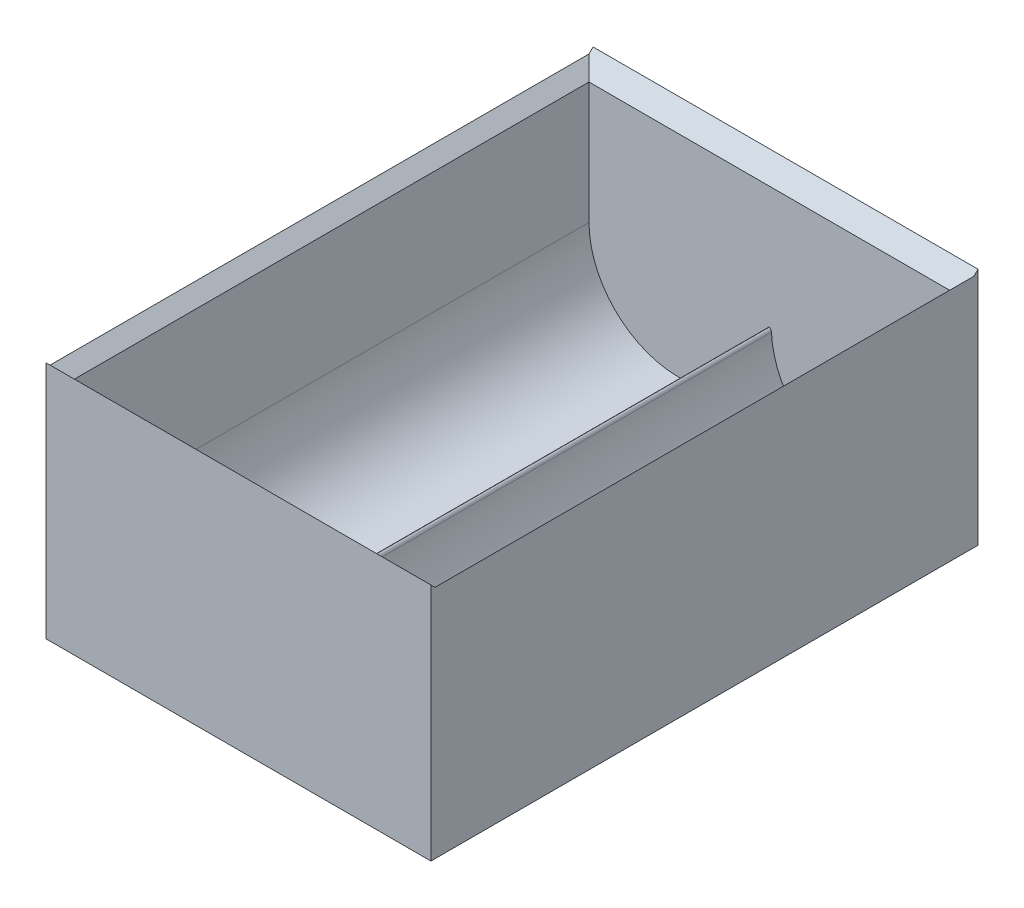
ISO-10303-21;
HEADER;
FILE_DESCRIPTION(('STEP AP214'),'2;1');
FILE_NAME('part.step','',(''),(''),'','','');
FILE_SCHEMA(('AUTOMOTIVE_DESIGN { 1 0 10303 214 1 1 1 1 }'));
ENDSEC;
DATA;
#1=APPLICATION_CONTEXT('core data for automotive mechanical design processes');
#2=APPLICATION_PROTOCOL_DEFINITION('international standard','automotive_design',2000,#1);
#3=PRODUCT_CONTEXT('',#1,'mechanical');
#4=PRODUCT('Part','Part','',(#3));
#5=PRODUCT_RELATED_PRODUCT_CATEGORY('part','',(#4));
#6=PRODUCT_DEFINITION_FORMATION('','',#4);
#7=PRODUCT_DEFINITION_CONTEXT('part definition',#1,'design');
#8=PRODUCT_DEFINITION('design','',#6,#7);
#9=PRODUCT_DEFINITION_SHAPE('','',#8);
#10=(LENGTH_UNIT() NAMED_UNIT(*) SI_UNIT(.MILLI.,.METRE.));
#11=(NAMED_UNIT(*) PLANE_ANGLE_UNIT() SI_UNIT($,.RADIAN.));
#12=(NAMED_UNIT(*) SI_UNIT($,.STERADIAN.) SOLID_ANGLE_UNIT());
#13=UNCERTAINTY_MEASURE_WITH_UNIT(LENGTH_MEASURE(1.E-05),#10,'distance_accuracy_value','');
#14=(GEOMETRIC_REPRESENTATION_CONTEXT(3) GLOBAL_UNCERTAINTY_ASSIGNED_CONTEXT((#13)) GLOBAL_UNIT_ASSIGNED_CONTEXT((#10,
#11,#12)) REPRESENTATION_CONTEXT('',''));
#15=CARTESIAN_POINT('',(0.,0.,0.));
#16=DIRECTION('',(0.,0.,1.));
#17=DIRECTION('',(1.,0.,0.));
#18=AXIS2_PLACEMENT_3D('',#15,#16,#17);
#19=CARTESIAN_POINT('',(47.5,65.,-67.5));
#20=DIRECTION('',(-1.,0.,0.));
#21=DIRECTION('',(0.,0.,1.));
#22=AXIS2_PLACEMENT_3D('',#19,#20,#21);
#23=PLANE('',#22);
#24=DIRECTION('',(0.,0.,1.));
#25=VECTOR('',#24,1.);
#26=CARTESIAN_POINT('',(47.5,57.9999999999999,-178.900179533069));
#27=LINE('',#26,#25);
#28=CARTESIAN_POINT('',(47.5,57.9999999999999,-66.5));
#29=VERTEX_POINT('',#28);
#30=CARTESIAN_POINT('',(47.5,57.9999999999999,66.5000000000001));
#31=VERTEX_POINT('',#30);
#32=EDGE_CURVE('E242',#29,#31,#27,.T.);
#33=ORIENTED_EDGE('',*,*,#32,.T.);
#34=DIRECTION('',(0.,0.707106781186544,0.707106781186551));
#35=VECTOR('',#34,1.);
#36=CARTESIAN_POINT('',(47.5,54.9999999999999,63.5));
#37=LINE('',#36,#35);
#38=CARTESIAN_POINT('',(47.5,58.9999999999999,67.5));
#39=VERTEX_POINT('',#38);
#40=EDGE_CURVE('E245',#31,#39,#37,.T.);
#41=ORIENTED_EDGE('',*,*,#40,.T.);
#42=DIRECTION('',(0.,-1.,0.));
#43=VECTOR('',#42,1.);
#44=CARTESIAN_POINT('',(47.5,65.,67.5));
#45=LINE('',#44,#43);
#46=CARTESIAN_POINT('',(47.5,0.,67.5));
#47=VERTEX_POINT('',#46);
#48=EDGE_CURVE('E205',#39,#47,#45,.T.);
#49=ORIENTED_EDGE('',*,*,#48,.T.);
#50=DIRECTION('',(0.,0.,-1.));
#51=VECTOR('',#50,1.);
#52=CARTESIAN_POINT('',(47.5,0.,-67.5));
#53=LINE('',#52,#51);
#54=CARTESIAN_POINT('',(47.5,0.,-67.5));
#55=VERTEX_POINT('',#54);
#56=EDGE_CURVE('E188',#47,#55,#53,.T.);
#57=ORIENTED_EDGE('',*,*,#56,.T.);
#58=DIRECTION('',(0.,-1.,0.));
#59=VECTOR('',#58,1.);
#60=CARTESIAN_POINT('',(47.5,65.,-67.5));
#61=LINE('',#60,#59);
#62=CARTESIAN_POINT('',(47.5,58.9999999999999,-67.5));
#63=VERTEX_POINT('',#62);
#64=EDGE_CURVE('E214',#63,#55,#61,.T.);
#65=ORIENTED_EDGE('',*,*,#64,.F.);
#66=DIRECTION('',(0.,0.707106781186544,-0.707106781186551));
#67=VECTOR('',#66,1.);
#68=CARTESIAN_POINT('',(47.5,65.,-73.5000000000002));
#69=LINE('',#68,#67);
#70=EDGE_CURVE('E239',#63,#29,#69,.F.);
#71=ORIENTED_EDGE('',*,*,#70,.T.);
#72=EDGE_LOOP('',(#33,#41,#49,#57,#65,#71));
#73=FACE_BOUND('',#72,.T.);
#74=ADVANCED_FACE('F49',(#73),#23,.F.);
#75=CARTESIAN_POINT('',(-47.5,65.,-67.5));
#76=DIRECTION('',(0.,0.,1.));
#77=DIRECTION('',(1.,0.,0.));
#78=AXIS2_PLACEMENT_3D('',#75,#76,#77);
#79=PLANE('',#78);
#80=DIRECTION('',(0.,-1.,0.));
#81=VECTOR('',#80,1.);
#82=CARTESIAN_POINT('',(-47.5,65.,-67.5));
#83=LINE('',#82,#81);
#84=CARTESIAN_POINT('',(-47.5,58.9999999999999,-67.5));
#85=VERTEX_POINT('',#84);
#86=CARTESIAN_POINT('',(-47.5,0.,-67.5));
#87=VERTEX_POINT('',#86);
#88=EDGE_CURVE('E211',#85,#87,#83,.T.);
#89=ORIENTED_EDGE('',*,*,#88,.F.);
#90=DIRECTION('',(-1.,0.,0.));
#91=VECTOR('',#90,1.);
#92=CARTESIAN_POINT('',(0.,58.9999999999999,-67.5));
#93=LINE('',#92,#91);
#94=EDGE_CURVE('E60',#85,#63,#93,.F.);
#95=ORIENTED_EDGE('',*,*,#94,.T.);
#96=ORIENTED_EDGE('',*,*,#64,.T.);
#97=DIRECTION('',(-1.,0.,0.));
#98=VECTOR('',#97,1.);
#99=CARTESIAN_POINT('',(-47.5,0.,-67.5));
#100=LINE('',#99,#98);
#101=EDGE_CURVE('E193',#55,#87,#100,.T.);
#102=ORIENTED_EDGE('',*,*,#101,.T.);
#103=EDGE_LOOP('',(#89,#95,#96,#102));
#104=FACE_BOUND('',#103,.T.);
#105=ADVANCED_FACE('F297',(#104),#79,.F.);
#106=CARTESIAN_POINT('',(-47.5,65.,-67.5));
#107=DIRECTION('',(1.,0.,0.));
#108=DIRECTION('',(0.,0.,-1.));
#109=AXIS2_PLACEMENT_3D('',#106,#107,#108);
#110=PLANE('',#109);
#111=DIRECTION('',(0.,-1.,0.));
#112=VECTOR('',#111,1.);
#113=CARTESIAN_POINT('',(-47.5,65.,67.5));
#114=LINE('',#113,#112);
#115=CARTESIAN_POINT('',(-47.5,58.9999999999999,67.5));
#116=VERTEX_POINT('',#115);
#117=CARTESIAN_POINT('',(-47.5,0.,67.5));
#118=VERTEX_POINT('',#117);
#119=EDGE_CURVE('E208',#116,#118,#114,.T.);
#120=ORIENTED_EDGE('',*,*,#119,.F.);
#121=DIRECTION('',(0.,-0.707106781186544,-0.707106781186551));
#122=VECTOR('',#121,1.);
#123=CARTESIAN_POINT('',(-47.5,54.9999999999999,63.5));
#124=LINE('',#123,#122);
#125=CARTESIAN_POINT('',(-47.5,57.9999999999999,66.5));
#126=VERTEX_POINT('',#125);
#127=EDGE_CURVE('E258',#116,#126,#124,.T.);
#128=ORIENTED_EDGE('',*,*,#127,.T.);
#129=DIRECTION('',(0.,0.,1.));
#130=VECTOR('',#129,1.);
#131=CARTESIAN_POINT('',(-47.5,57.9999999999999,0.));
#132=LINE('',#131,#130);
#133=CARTESIAN_POINT('',(-47.5,57.9999999999999,-66.5));
#134=VERTEX_POINT('',#133);
#135=EDGE_CURVE('E255',#126,#134,#132,.F.);
#136=ORIENTED_EDGE('',*,*,#135,.T.);
#137=DIRECTION('',(0.,-0.707106781186544,0.707106781186551));
#138=VECTOR('',#137,1.);
#139=CARTESIAN_POINT('',(-47.5,65.,-73.5000000000002));
#140=LINE('',#139,#138);
#141=EDGE_CURVE('E252',#134,#85,#140,.F.);
#142=ORIENTED_EDGE('',*,*,#141,.T.);
#143=ORIENTED_EDGE('',*,*,#88,.T.);
#144=DIRECTION('',(0.,0.,1.));
#145=VECTOR('',#144,1.);
#146=CARTESIAN_POINT('',(-47.5,0.,-67.5));
#147=LINE('',#146,#145);
#148=EDGE_CURVE('E197',#87,#118,#147,.T.);
#149=ORIENTED_EDGE('',*,*,#148,.T.);
#150=EDGE_LOOP('',(#120,#128,#136,#142,#143,#149));
#151=FACE_BOUND('',#150,.T.);
#152=ADVANCED_FACE('F295',(#151),#110,.F.);
#153=CARTESIAN_POINT('',(-47.5,65.,67.5));
#154=DIRECTION('',(0.,0.,-1.));
#155=DIRECTION('',(-1.,0.,0.));
#156=AXIS2_PLACEMENT_3D('',#153,#154,#155);
#157=PLANE('',#156);
#158=ORIENTED_EDGE('',*,*,#48,.F.);
#159=DIRECTION('',(-1.,0.,0.));
#160=VECTOR('',#159,1.);
#161=CARTESIAN_POINT('',(0.,58.9999999999999,67.5));
#162=LINE('',#161,#160);
#163=EDGE_CURVE('E249',#39,#116,#162,.T.);
#164=ORIENTED_EDGE('',*,*,#163,.T.);
#165=ORIENTED_EDGE('',*,*,#119,.T.);
#166=DIRECTION('',(1.,0.,0.));
#167=VECTOR('',#166,1.);
#168=CARTESIAN_POINT('',(-47.5,0.,67.5));
#169=LINE('',#168,#167);
#170=EDGE_CURVE('E201',#118,#47,#169,.T.);
#171=ORIENTED_EDGE('',*,*,#170,.T.);
#172=EDGE_LOOP('',(#158,#164,#165,#171));
#173=FACE_BOUND('',#172,.T.);
#174=ADVANCED_FACE('F386',(#173),#157,.F.);
#175=CARTESIAN_POINT('',(0.,0.,0.));
#176=DIRECTION('',(0.,1.,0.));
#177=DIRECTION('',(0.,0.,1.));
#178=AXIS2_PLACEMENT_3D('',#175,#176,#177);
#179=PLANE('',#178);
#180=ORIENTED_EDGE('',*,*,#56,.F.);
#181=ORIENTED_EDGE('',*,*,#170,.F.);
#182=ORIENTED_EDGE('',*,*,#148,.F.);
#183=ORIENTED_EDGE('',*,*,#101,.F.);
#184=EDGE_LOOP('',(#180,#181,#182,#183));
#185=FACE_BOUND('',#184,.T.);
#186=ADVANCED_FACE('F304',(#185),#179,.F.);
#187=CARTESIAN_POINT('',(22.5,25.,-178.900179533069));
#188=DIRECTION('',(0.,0.,1.));
#189=DIRECTION('',(1.,0.,0.));
#190=AXIS2_PLACEMENT_3D('',#187,#188,#189);
#191=CYLINDRICAL_SURFACE('',#190,22.);
#192=CARTESIAN_POINT('',(22.5,25.,-63.5));
#193=DIRECTION('',(0.,0.,1.));
#194=DIRECTION('',(1.,0.,0.));
#195=AXIS2_PLACEMENT_3D('',#192,#193,#194);
#196=CIRCLE('',#195,22.);
#197=CARTESIAN_POINT('',(0.520803787158835,24.0434782608696,-63.5));
#198=VERTEX_POINT('',#197);
#199=CARTESIAN_POINT('',(44.5,25.,-63.5));
#200=VERTEX_POINT('',#199);
#201=EDGE_CURVE('E189',#198,#200,#196,.T.);
#202=ORIENTED_EDGE('',*,*,#201,.F.);
#203=DIRECTION('',(0.,0.,1.));
#204=VECTOR('',#203,1.);
#205=CARTESIAN_POINT('',(0.520803787158835,24.0434782608696,-178.900179533069));
#206=LINE('',#205,#204);
#207=CARTESIAN_POINT('',(0.520803787158835,24.0434782608696,63.5));
#208=VERTEX_POINT('',#207);
#209=EDGE_CURVE('E163',#198,#208,#206,.T.);
#210=ORIENTED_EDGE('',*,*,#209,.T.);
#211=CARTESIAN_POINT('',(22.5,25.,63.5));
#212=DIRECTION('',(0.,0.,1.));
#213=DIRECTION('',(1.,0.,0.));
#214=AXIS2_PLACEMENT_3D('',#211,#212,#213);
#215=CIRCLE('',#214,22.);
#216=CARTESIAN_POINT('',(44.5,25.,63.5));
#217=VERTEX_POINT('',#216);
#218=EDGE_CURVE('E160',#217,#208,#215,.F.);
#219=ORIENTED_EDGE('',*,*,#218,.F.);
#220=DIRECTION('',(0.,0.,1.));
#221=VECTOR('',#220,1.);
#222=CARTESIAN_POINT('',(44.5,25.,-178.900179533069));
#223=LINE('',#222,#221);
#224=EDGE_CURVE('E145',#200,#217,#223,.T.);
#225=ORIENTED_EDGE('',*,*,#224,.F.);
#226=EDGE_LOOP('',(#202,#210,#219,#225));
#227=FACE_BOUND('',#226,.T.);
#228=ADVANCED_FACE('F161',(#227),#191,.F.);
#229=CARTESIAN_POINT('',(-22.5,25.,-178.900179533069));
#230=DIRECTION('',(0.,0.,1.));
#231=DIRECTION('',(1.,0.,0.));
#232=AXIS2_PLACEMENT_3D('',#229,#230,#231);
#233=CYLINDRICAL_SURFACE('',#232,22.);
#234=CARTESIAN_POINT('',(-22.5,25.,63.5));
#235=DIRECTION('',(0.,0.,1.));
#236=DIRECTION('',(1.,0.,0.));
#237=AXIS2_PLACEMENT_3D('',#234,#235,#236);
#238=CIRCLE('',#237,22.);
#239=CARTESIAN_POINT('',(-44.5,25.,63.5));
#240=VERTEX_POINT('',#239);
#241=CARTESIAN_POINT('',(-0.520803787158835,24.0434782608696,63.5));
#242=VERTEX_POINT('',#241);
#243=EDGE_CURVE('E156',#240,#242,#238,.T.);
#244=ORIENTED_EDGE('',*,*,#243,.T.);
#245=DIRECTION('',(0.,0.,1.));
#246=VECTOR('',#245,1.);
#247=CARTESIAN_POINT('',(-0.520803787158835,24.0434782608696,-178.900179533069));
#248=LINE('',#247,#246);
#249=CARTESIAN_POINT('',(-0.520803787158835,24.0434782608696,-63.5));
#250=VERTEX_POINT('',#249);
#251=EDGE_CURVE('E219',#242,#250,#248,.F.);
#252=ORIENTED_EDGE('',*,*,#251,.T.);
#253=CARTESIAN_POINT('',(-22.5,25.,-63.5));
#254=DIRECTION('',(0.,0.,1.));
#255=DIRECTION('',(1.,0.,0.));
#256=AXIS2_PLACEMENT_3D('',#253,#254,#255);
#257=CIRCLE('',#256,22.);
#258=CARTESIAN_POINT('',(-44.5,25.,-63.5));
#259=VERTEX_POINT('',#258);
#260=EDGE_CURVE('E359',#250,#259,#257,.F.);
#261=ORIENTED_EDGE('',*,*,#260,.T.);
#262=DIRECTION('',(0.,0.,1.));
#263=VECTOR('',#262,1.);
#264=CARTESIAN_POINT('',(-44.5,25.,-178.900179533069));
#265=LINE('',#264,#263);
#266=EDGE_CURVE('E155',#259,#240,#265,.T.);
#267=ORIENTED_EDGE('',*,*,#266,.T.);
#268=EDGE_LOOP('',(#244,#252,#261,#267));
#269=FACE_BOUND('',#268,.T.);
#270=ADVANCED_FACE('F368',(#269),#233,.F.);
#271=CARTESIAN_POINT('',(-44.5,0.,-178.900179533069));
#272=DIRECTION('',(1.,0.,0.));
#273=DIRECTION('',(0.,1.,0.));
#274=AXIS2_PLACEMENT_3D('',#271,#272,#273);
#275=PLANE('',#274);
#276=DIRECTION('',(0.,-1.,0.));
#277=VECTOR('',#276,1.);
#278=CARTESIAN_POINT('',(-44.5,0.,-63.5));
#279=LINE('',#278,#277);
#280=CARTESIAN_POINT('',(-44.5,54.9999999999999,-63.5));
#281=VERTEX_POINT('',#280);
#282=EDGE_CURVE('E184',#281,#259,#279,.T.);
#283=ORIENTED_EDGE('',*,*,#282,.F.);
#284=DIRECTION('',(0.,0.,1.));
#285=VECTOR('',#284,1.);
#286=CARTESIAN_POINT('',(-44.5,54.9999999999999,-178.900179533069));
#287=LINE('',#286,#285);
#288=CARTESIAN_POINT('',(-44.5,54.9999999999999,63.5));
#289=VERTEX_POINT('',#288);
#290=EDGE_CURVE('E263',#281,#289,#287,.T.);
#291=ORIENTED_EDGE('',*,*,#290,.T.);
#292=DIRECTION('',(0.,1.,0.));
#293=VECTOR('',#292,1.);
#294=CARTESIAN_POINT('',(-44.5,0.,63.5));
#295=LINE('',#294,#293);
#296=EDGE_CURVE('E174',#240,#289,#295,.T.);
#297=ORIENTED_EDGE('',*,*,#296,.F.);
#298=ORIENTED_EDGE('',*,*,#266,.F.);
#299=EDGE_LOOP('',(#283,#291,#297,#298));
#300=FACE_BOUND('',#299,.T.);
#301=ADVANCED_FACE('F370',(#300),#275,.T.);
#302=CARTESIAN_POINT('',(44.5,0.,-178.900179533069));
#303=DIRECTION('',(1.,0.,0.));
#304=DIRECTION('',(0.,1.,0.));
#305=AXIS2_PLACEMENT_3D('',#302,#303,#304);
#306=PLANE('',#305);
#307=DIRECTION('',(0.,1.,0.));
#308=VECTOR('',#307,1.);
#309=CARTESIAN_POINT('',(44.5,0.,63.5));
#310=LINE('',#309,#308);
#311=CARTESIAN_POINT('',(44.5,54.9999999999999,63.5));
#312=VERTEX_POINT('',#311);
#313=EDGE_CURVE('E149',#217,#312,#310,.T.);
#314=ORIENTED_EDGE('',*,*,#313,.T.);
#315=DIRECTION('',(0.,0.,-1.));
#316=VECTOR('',#315,1.);
#317=CARTESIAN_POINT('',(44.5,54.9999999999999,-63.5));
#318=LINE('',#317,#316);
#319=CARTESIAN_POINT('',(44.5,54.9999999999999,-63.5));
#320=VERTEX_POINT('',#319);
#321=EDGE_CURVE('E74',#312,#320,#318,.T.);
#322=ORIENTED_EDGE('',*,*,#321,.T.);
#323=DIRECTION('',(0.,-1.,0.));
#324=VECTOR('',#323,1.);
#325=CARTESIAN_POINT('',(44.5,0.,-63.5));
#326=LINE('',#325,#324);
#327=EDGE_CURVE('E150',#320,#200,#326,.T.);
#328=ORIENTED_EDGE('',*,*,#327,.T.);
#329=ORIENTED_EDGE('',*,*,#224,.T.);
#330=EDGE_LOOP('',(#314,#322,#328,#329));
#331=FACE_BOUND('',#330,.T.);
#332=ADVANCED_FACE('F147',(#331),#306,.F.);
#333=CARTESIAN_POINT('',(0.,0.,63.5));
#334=DIRECTION('',(0.,0.,1.));
#335=DIRECTION('',(1.,0.,0.));
#336=AXIS2_PLACEMENT_3D('',#333,#334,#335);
#337=PLANE('',#336);
#338=ORIENTED_EDGE('',*,*,#296,.T.);
#339=DIRECTION('',(1.,0.,0.));
#340=VECTOR('',#339,1.);
#341=CARTESIAN_POINT('',(44.5,54.9999999999999,63.5));
#342=LINE('',#341,#340);
#343=EDGE_CURVE('E172',#289,#312,#342,.T.);
#344=ORIENTED_EDGE('',*,*,#343,.T.);
#345=ORIENTED_EDGE('',*,*,#313,.F.);
#346=ORIENTED_EDGE('',*,*,#218,.T.);
#347=CARTESIAN_POINT('',(-0.478250586152123,24.,63.5));
#348=DIRECTION('',(0.,0.,1.));
#349=DIRECTION('',(1.,0.,0.));
#350=AXIS2_PLACEMENT_3D('',#347,#348,#349);
#351=CIRCLE('',#350,1.);
#352=CARTESIAN_POINT('',(0.,24.878223420802,63.5));
#353=VERTEX_POINT('',#352);
#354=EDGE_CURVE('E222',#208,#353,#351,.T.);
#355=ORIENTED_EDGE('',*,*,#354,.T.);
#356=CARTESIAN_POINT('',(0.478250586152123,24.,63.5));
#357=DIRECTION('',(0.,0.,1.));
#358=DIRECTION('',(1.,0.,0.));
#359=AXIS2_PLACEMENT_3D('',#356,#357,#358);
#360=CIRCLE('',#359,1.);
#361=EDGE_CURVE('E228',#353,#242,#360,.T.);
#362=ORIENTED_EDGE('',*,*,#361,.T.);
#363=ORIENTED_EDGE('',*,*,#243,.F.);
#364=EDGE_LOOP('',(#338,#344,#345,#346,#355,#362,#363));
#365=FACE_BOUND('',#364,.T.);
#366=ADVANCED_FACE('F170',(#365),#337,.F.);
#367=CARTESIAN_POINT('',(-47.5,65.,-63.5));
#368=DIRECTION('',(0.,0.,1.));
#369=DIRECTION('',(1.,0.,0.));
#370=AXIS2_PLACEMENT_3D('',#367,#368,#369);
#371=PLANE('',#370);
#372=ORIENTED_EDGE('',*,*,#327,.F.);
#373=DIRECTION('',(-1.,0.,0.));
#374=VECTOR('',#373,1.);
#375=CARTESIAN_POINT('',(-47.5,54.9999999999999,-63.5));
#376=LINE('',#375,#374);
#377=EDGE_CURVE('E12',#320,#281,#376,.T.);
#378=ORIENTED_EDGE('',*,*,#377,.T.);
#379=ORIENTED_EDGE('',*,*,#282,.T.);
#380=ORIENTED_EDGE('',*,*,#260,.F.);
#381=CARTESIAN_POINT('',(0.478250586152123,24.,-63.5));
#382=DIRECTION('',(0.,0.,1.));
#383=DIRECTION('',(1.,0.,0.));
#384=AXIS2_PLACEMENT_3D('',#381,#382,#383);
#385=CIRCLE('',#384,1.);
#386=CARTESIAN_POINT('',(0.,24.878223420802,-63.5));
#387=VERTEX_POINT('',#386);
#388=EDGE_CURVE('E231',#250,#387,#385,.F.);
#389=ORIENTED_EDGE('',*,*,#388,.T.);
#390=CARTESIAN_POINT('',(-0.478250586152123,24.,-63.5));
#391=DIRECTION('',(0.,0.,1.));
#392=DIRECTION('',(1.,0.,0.));
#393=AXIS2_PLACEMENT_3D('',#390,#391,#392);
#394=CIRCLE('',#393,1.);
#395=EDGE_CURVE('E225',#387,#198,#394,.F.);
#396=ORIENTED_EDGE('',*,*,#395,.T.);
#397=ORIENTED_EDGE('',*,*,#201,.T.);
#398=EDGE_LOOP('',(#372,#378,#379,#380,#389,#396,#397));
#399=FACE_BOUND('',#398,.T.);
#400=ADVANCED_FACE('F335',(#399),#371,.T.);
#401=CARTESIAN_POINT('',(0.478250586152123,24.,-178.900179533069));
#402=DIRECTION('',(0.,0.,1.));
#403=DIRECTION('',(1.,0.,0.));
#404=AXIS2_PLACEMENT_3D('',#401,#402,#403);
#405=CYLINDRICAL_SURFACE('',#404,1.);
#406=DIRECTION('',(0.,0.,1.));
#407=VECTOR('',#406,1.);
#408=CARTESIAN_POINT('',(0.,24.878223420802,0.));
#409=LINE('',#408,#407);
#410=EDGE_CURVE('E166',#387,#353,#409,.T.);
#411=ORIENTED_EDGE('',*,*,#410,.F.);
#412=ORIENTED_EDGE('',*,*,#388,.F.);
#413=ORIENTED_EDGE('',*,*,#251,.F.);
#414=ORIENTED_EDGE('',*,*,#361,.F.);
#415=EDGE_LOOP('',(#411,#412,#413,#414));
#416=FACE_BOUND('',#415,.T.);
#417=ADVANCED_FACE('F332',(#416),#405,.T.);
#418=CARTESIAN_POINT('',(-0.478250586152123,24.,-178.900179533069));
#419=DIRECTION('',(0.,0.,1.));
#420=DIRECTION('',(1.,0.,0.));
#421=AXIS2_PLACEMENT_3D('',#418,#419,#420);
#422=CYLINDRICAL_SURFACE('',#421,1.);
#423=ORIENTED_EDGE('',*,*,#395,.F.);
#424=ORIENTED_EDGE('',*,*,#410,.T.);
#425=ORIENTED_EDGE('',*,*,#354,.F.);
#426=ORIENTED_EDGE('',*,*,#209,.F.);
#427=EDGE_LOOP('',(#423,#424,#425,#426));
#428=FACE_BOUND('',#427,.T.);
#429=ADVANCED_FACE('F330',(#428),#422,.T.);
#430=CARTESIAN_POINT('',(0.,65.,-73.5000000000002));
#431=DIRECTION('',(0.,-0.707106781186551,-0.707106781186544));
#432=DIRECTION('',(1.,0.,0.));
#433=AXIS2_PLACEMENT_3D('',#430,#431,#432);
#434=PLANE('',#433);
#435=ORIENTED_EDGE('',*,*,#94,.F.);
#436=ORIENTED_EDGE('',*,*,#141,.F.);
#437=DIRECTION('',(-0.577350269189628,0.577350269189622,-0.577350269189628));
#438=VECTOR('',#437,1.);
#439=CARTESIAN_POINT('',(-36.3333333333333,46.8333333333333,-55.3333333333333));
#440=LINE('',#439,#438);
#441=EDGE_CURVE('E54',#281,#134,#440,.T.);
#442=ORIENTED_EDGE('',*,*,#441,.F.);
#443=ORIENTED_EDGE('',*,*,#377,.F.);
#444=DIRECTION('',(0.577350269189628,0.577350269189622,-0.577350269189628));
#445=VECTOR('',#444,1.);
#446=CARTESIAN_POINT('',(36.3333333333333,46.8333333333333,-55.3333333333333));
#447=LINE('',#446,#445);
#448=EDGE_CURVE('E274',#29,#320,#447,.F.);
#449=ORIENTED_EDGE('',*,*,#448,.F.);
#450=ORIENTED_EDGE('',*,*,#70,.F.);
#451=EDGE_LOOP('',(#435,#436,#442,#443,#449,#450));
#452=FACE_BOUND('',#451,.T.);
#453=ADVANCED_FACE('F52',(#452),#434,.F.);
#454=CARTESIAN_POINT('',(-54.5000000000002,65.,0.));
#455=DIRECTION('',(-0.707106781186544,-0.707106781186551,0.));
#456=DIRECTION('',(0.,0.,-1.));
#457=AXIS2_PLACEMENT_3D('',#454,#455,#456);
#458=PLANE('',#457);
#459=ORIENTED_EDGE('',*,*,#441,.T.);
#460=ORIENTED_EDGE('',*,*,#135,.F.);
#461=DIRECTION('',(0.577350269189628,-0.577350269189622,-0.577350269189628));
#462=VECTOR('',#461,1.);
#463=CARTESIAN_POINT('',(-29.9999999999999,40.5,48.9999999999999));
#464=LINE('',#463,#462);
#465=EDGE_CURVE('E271',#289,#126,#464,.F.);
#466=ORIENTED_EDGE('',*,*,#465,.F.);
#467=ORIENTED_EDGE('',*,*,#290,.F.);
#468=EDGE_LOOP('',(#459,#460,#466,#467));
#469=FACE_BOUND('',#468,.T.);
#470=ADVANCED_FACE('F286',(#469),#458,.F.);
#471=CARTESIAN_POINT('',(44.5,54.9999999999999,-178.900179533069));
#472=DIRECTION('',(-0.707106781186544,0.707106781186551,0.));
#473=DIRECTION('',(0.,0.,1.));
#474=AXIS2_PLACEMENT_3D('',#471,#472,#473);
#475=PLANE('',#474);
#476=ORIENTED_EDGE('',*,*,#448,.T.);
#477=ORIENTED_EDGE('',*,*,#321,.F.);
#478=DIRECTION('',(-0.577350269189628,-0.577350269189622,-0.577350269189628));
#479=VECTOR('',#478,1.);
#480=CARTESIAN_POINT('',(-36.3000598443569,-25.8000598443561,-17.3000598443569));
#481=LINE('',#480,#479);
#482=EDGE_CURVE('E268',#31,#312,#481,.T.);
#483=ORIENTED_EDGE('',*,*,#482,.F.);
#484=ORIENTED_EDGE('',*,*,#32,.F.);
#485=EDGE_LOOP('',(#476,#477,#483,#484));
#486=FACE_BOUND('',#485,.T.);
#487=ADVANCED_FACE('F311',(#486),#475,.T.);
#488=CARTESIAN_POINT('',(0.,54.9999999999999,63.5));
#489=DIRECTION('',(0.,0.707106781186551,-0.707106781186544));
#490=DIRECTION('',(-1.,0.,0.));
#491=AXIS2_PLACEMENT_3D('',#488,#489,#490);
#492=PLANE('',#491);
#493=ORIENTED_EDGE('',*,*,#127,.F.);
#494=ORIENTED_EDGE('',*,*,#163,.F.);
#495=ORIENTED_EDGE('',*,*,#40,.F.);
#496=ORIENTED_EDGE('',*,*,#482,.T.);
#497=ORIENTED_EDGE('',*,*,#343,.F.);
#498=ORIENTED_EDGE('',*,*,#465,.T.);
#499=EDGE_LOOP('',(#493,#494,#495,#496,#497,#498));
#500=FACE_BOUND('',#499,.T.);
#501=ADVANCED_FACE('F308',(#500),#492,.T.);
#502=CLOSED_SHELL('',(#74,#105,#152,#174,#186,#228,#270,#301,#332,#366,#400,#417,#429,#453,#470,
#487,#501));
#503=MANIFOLD_SOLID_BREP('B2',#502);
#504=ADVANCED_BREP_SHAPE_REPRESENTATION('',(#18,#503),#14);
#505=SHAPE_DEFINITION_REPRESENTATION(#9,#504);
ENDSEC;
END-ISO-10303-21;
